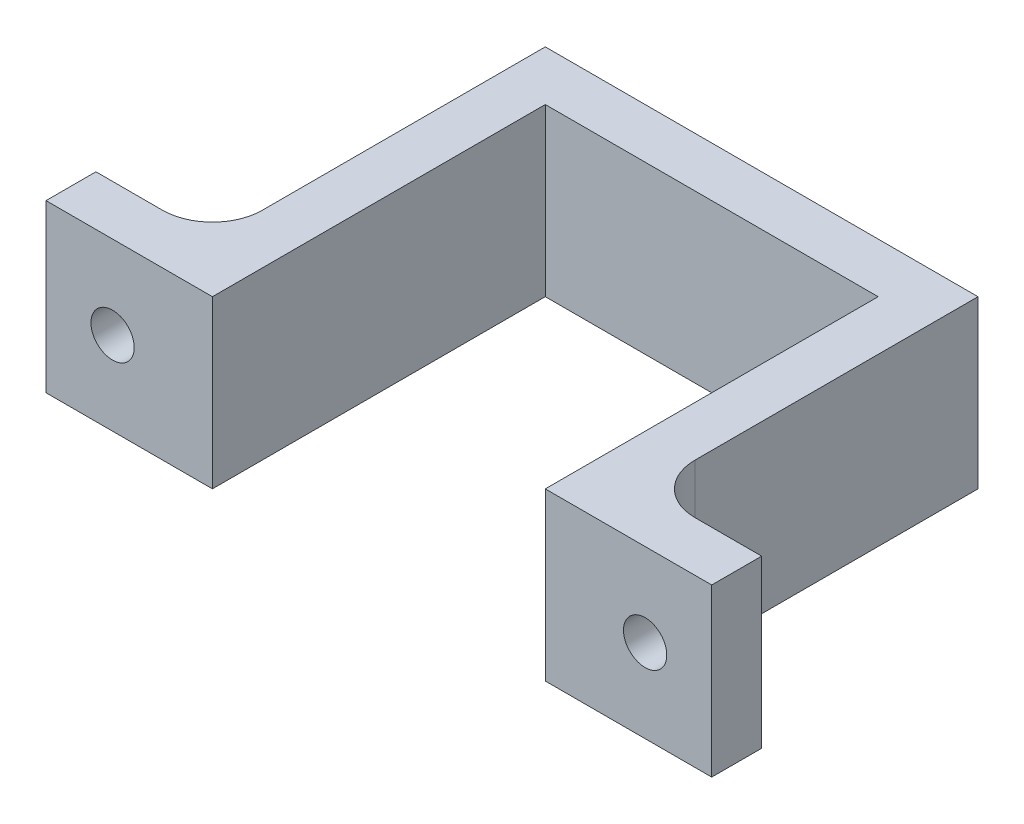
ISO-10303-21;
HEADER;
FILE_DESCRIPTION(('STEP AP214'),'2;1');
FILE_NAME('part.step','',(''),(''),'','','');
FILE_SCHEMA(('AUTOMOTIVE_DESIGN { 1 0 10303 214 1 1 1 1 }'));
ENDSEC;
DATA;
#1=APPLICATION_CONTEXT('core data for automotive mechanical design processes');
#2=APPLICATION_PROTOCOL_DEFINITION('international standard','automotive_design',2000,#1);
#3=PRODUCT_CONTEXT('',#1,'mechanical');
#4=PRODUCT('Part','Part','',(#3));
#5=PRODUCT_RELATED_PRODUCT_CATEGORY('part','',(#4));
#6=PRODUCT_DEFINITION_FORMATION('','',#4);
#7=PRODUCT_DEFINITION_CONTEXT('part definition',#1,'design');
#8=PRODUCT_DEFINITION('design','',#6,#7);
#9=PRODUCT_DEFINITION_SHAPE('','',#8);
#10=(LENGTH_UNIT() NAMED_UNIT(*) SI_UNIT(.MILLI.,.METRE.));
#11=(NAMED_UNIT(*) PLANE_ANGLE_UNIT() SI_UNIT($,.RADIAN.));
#12=(NAMED_UNIT(*) SI_UNIT($,.STERADIAN.) SOLID_ANGLE_UNIT());
#13=UNCERTAINTY_MEASURE_WITH_UNIT(LENGTH_MEASURE(1.E-05),#10,'distance_accuracy_value','');
#14=(GEOMETRIC_REPRESENTATION_CONTEXT(3) GLOBAL_UNCERTAINTY_ASSIGNED_CONTEXT((#13)) GLOBAL_UNIT_ASSIGNED_CONTEXT((#10,
#11,#12)) REPRESENTATION_CONTEXT('',''));
#15=CARTESIAN_POINT('',(0.,0.,0.));
#16=DIRECTION('',(0.,0.,1.));
#17=DIRECTION('',(1.,0.,0.));
#18=AXIS2_PLACEMENT_3D('',#15,#16,#17);
#19=CARTESIAN_POINT('',(-20.,10.,11.5));
#20=DIRECTION('',(0.,0.,-1.));
#21=DIRECTION('',(-1.,0.,0.));
#22=AXIS2_PLACEMENT_3D('',#19,#20,#21);
#23=PLANE('',#22);
#24=CARTESIAN_POINT('',(-16.,5.,11.5));
#25=DIRECTION('',(0.,0.,-1.));
#26=DIRECTION('',(-1.,0.,0.));
#27=AXIS2_PLACEMENT_3D('',#24,#25,#26);
#28=CIRCLE('',#27,1.3);
#29=CARTESIAN_POINT('',(-17.3,5.,11.5));
#30=VERTEX_POINT('',#29);
#31=EDGE_CURVE('E307',#30,#30,#28,.T.);
#32=ORIENTED_EDGE('',*,*,#31,.T.);
#33=EDGE_LOOP('',(#32));
#34=FACE_BOUND('',#33,.T.);
#35=DIRECTION('',(1.,0.,0.));
#36=VECTOR('',#35,1.);
#37=CARTESIAN_POINT('',(-20.,0.,11.5));
#38=LINE('',#37,#36);
#39=CARTESIAN_POINT('',(-20.,0.,11.5));
#40=VERTEX_POINT('',#39);
#41=CARTESIAN_POINT('',(-10.,0.,11.5));
#42=VERTEX_POINT('',#41);
#43=EDGE_CURVE('E168',#40,#42,#38,.T.);
#44=ORIENTED_EDGE('',*,*,#43,.T.);
#45=DIRECTION('',(0.,1.,0.));
#46=VECTOR('',#45,1.);
#47=CARTESIAN_POINT('',(-10.,0.,11.5));
#48=LINE('',#47,#46);
#49=CARTESIAN_POINT('',(-10.,10.,11.5));
#50=VERTEX_POINT('',#49);
#51=EDGE_CURVE('E150',#42,#50,#48,.T.);
#52=ORIENTED_EDGE('',*,*,#51,.T.);
#53=DIRECTION('',(1.,0.,0.));
#54=VECTOR('',#53,1.);
#55=CARTESIAN_POINT('',(-20.,10.,11.5));
#56=LINE('',#55,#54);
#57=CARTESIAN_POINT('',(-20.,10.,11.5));
#58=VERTEX_POINT('',#57);
#59=EDGE_CURVE('E189',#58,#50,#56,.T.);
#60=ORIENTED_EDGE('',*,*,#59,.F.);
#61=DIRECTION('',(0.,-1.,0.));
#62=VECTOR('',#61,1.);
#63=CARTESIAN_POINT('',(-20.,10.,11.5));
#64=LINE('',#63,#62);
#65=EDGE_CURVE('E175',#58,#40,#64,.T.);
#66=ORIENTED_EDGE('',*,*,#65,.T.);
#67=EDGE_LOOP('',(#44,#52,#60,#66));
#68=FACE_BOUND('',#67,.T.);
#69=ADVANCED_FACE('F35',(#34,#68),#23,.F.);
#70=CARTESIAN_POINT('',(20.,10.,-11.5));
#71=DIRECTION('',(-1.,0.,0.));
#72=DIRECTION('',(0.,0.,1.));
#73=AXIS2_PLACEMENT_3D('',#70,#71,#72);
#74=PLANE('',#73);
#75=DIRECTION('',(0.,0.,-1.));
#76=VECTOR('',#75,1.);
#77=CARTESIAN_POINT('',(20.,0.,-11.5));
#78=LINE('',#77,#76);
#79=CARTESIAN_POINT('',(20.,0.,11.5));
#80=VERTEX_POINT('',#79);
#81=CARTESIAN_POINT('',(20.,0.,8.5));
#82=VERTEX_POINT('',#81);
#83=EDGE_CURVE('E342',#80,#82,#78,.T.);
#84=ORIENTED_EDGE('',*,*,#83,.T.);
#85=DIRECTION('',(0.,1.,0.));
#86=VECTOR('',#85,1.);
#87=CARTESIAN_POINT('',(20.,0.,8.5));
#88=LINE('',#87,#86);
#89=CARTESIAN_POINT('',(20.,10.,8.5));
#90=VERTEX_POINT('',#89);
#91=EDGE_CURVE('E326',#82,#90,#88,.T.);
#92=ORIENTED_EDGE('',*,*,#91,.T.);
#93=DIRECTION('',(0.,0.,-1.));
#94=VECTOR('',#93,1.);
#95=CARTESIAN_POINT('',(20.,10.,-11.5));
#96=LINE('',#95,#94);
#97=CARTESIAN_POINT('',(20.,10.,11.5));
#98=VERTEX_POINT('',#97);
#99=EDGE_CURVE('E176',#98,#90,#96,.T.);
#100=ORIENTED_EDGE('',*,*,#99,.F.);
#101=DIRECTION('',(0.,-1.,0.));
#102=VECTOR('',#101,1.);
#103=CARTESIAN_POINT('',(20.,10.,11.5));
#104=LINE('',#103,#102);
#105=EDGE_CURVE('E186',#98,#80,#104,.T.);
#106=ORIENTED_EDGE('',*,*,#105,.T.);
#107=EDGE_LOOP('',(#84,#92,#100,#106));
#108=FACE_BOUND('',#107,.T.);
#109=ADVANCED_FACE('F214',(#108),#74,.F.);
#110=CARTESIAN_POINT('',(-20.,10.,-11.5));
#111=DIRECTION('',(0.,0.,1.));
#112=DIRECTION('',(1.,0.,0.));
#113=AXIS2_PLACEMENT_3D('',#110,#111,#112);
#114=PLANE('',#113);
#115=DIRECTION('',(-1.,0.,0.));
#116=VECTOR('',#115,1.);
#117=CARTESIAN_POINT('',(-20.,10.,-11.5));
#118=LINE('',#117,#116);
#119=CARTESIAN_POINT('',(13.,10.,-11.5));
#120=VERTEX_POINT('',#119);
#121=CARTESIAN_POINT('',(-13.,10.,-11.5));
#122=VERTEX_POINT('',#121);
#123=EDGE_CURVE('E180',#120,#122,#118,.T.);
#124=ORIENTED_EDGE('',*,*,#123,.F.);
#125=DIRECTION('',(0.,1.,0.));
#126=VECTOR('',#125,1.);
#127=CARTESIAN_POINT('',(13.,0.,-11.5));
#128=LINE('',#127,#126);
#129=CARTESIAN_POINT('',(13.,0.,-11.5));
#130=VERTEX_POINT('',#129);
#131=EDGE_CURVE('E288',#130,#120,#128,.T.);
#132=ORIENTED_EDGE('',*,*,#131,.F.);
#133=DIRECTION('',(-1.,0.,0.));
#134=VECTOR('',#133,1.);
#135=CARTESIAN_POINT('',(-20.,0.,-11.5));
#136=LINE('',#135,#134);
#137=CARTESIAN_POINT('',(-13.,0.,-11.5));
#138=VERTEX_POINT('',#137);
#139=EDGE_CURVE('E350',#130,#138,#136,.T.);
#140=ORIENTED_EDGE('',*,*,#139,.T.);
#141=DIRECTION('',(0.,1.,0.));
#142=VECTOR('',#141,1.);
#143=CARTESIAN_POINT('',(-13.,0.,-11.5));
#144=LINE('',#143,#142);
#145=EDGE_CURVE('E339',#138,#122,#144,.T.);
#146=ORIENTED_EDGE('',*,*,#145,.T.);
#147=EDGE_LOOP('',(#124,#132,#140,#146));
#148=FACE_BOUND('',#147,.T.);
#149=ADVANCED_FACE('F217',(#148),#114,.F.);
#150=CARTESIAN_POINT('',(-20.,10.,-11.5));
#151=DIRECTION('',(1.,0.,0.));
#152=DIRECTION('',(0.,0.,-1.));
#153=AXIS2_PLACEMENT_3D('',#150,#151,#152);
#154=PLANE('',#153);
#155=DIRECTION('',(0.,0.,1.));
#156=VECTOR('',#155,1.);
#157=CARTESIAN_POINT('',(-20.,10.,-11.5));
#158=LINE('',#157,#156);
#159=CARTESIAN_POINT('',(-20.,10.,8.5));
#160=VERTEX_POINT('',#159);
#161=EDGE_CURVE('E345',#160,#58,#158,.T.);
#162=ORIENTED_EDGE('',*,*,#161,.F.);
#163=DIRECTION('',(0.,1.,0.));
#164=VECTOR('',#163,1.);
#165=CARTESIAN_POINT('',(-20.,0.,8.5));
#166=LINE('',#165,#164);
#167=CARTESIAN_POINT('',(-20.,0.,8.5));
#168=VERTEX_POINT('',#167);
#169=EDGE_CURVE('E336',#168,#160,#166,.T.);
#170=ORIENTED_EDGE('',*,*,#169,.F.);
#171=DIRECTION('',(0.,0.,1.));
#172=VECTOR('',#171,1.);
#173=CARTESIAN_POINT('',(-20.,0.,-11.5));
#174=LINE('',#173,#172);
#175=EDGE_CURVE('E182',#168,#40,#174,.T.);
#176=ORIENTED_EDGE('',*,*,#175,.T.);
#177=ORIENTED_EDGE('',*,*,#65,.F.);
#178=EDGE_LOOP('',(#162,#170,#176,#177));
#179=FACE_BOUND('',#178,.T.);
#180=ADVANCED_FACE('F221',(#179),#154,.F.);
#181=CARTESIAN_POINT('',(16.,5.,11.5));
#182=DIRECTION('',(0.,0.,-1.));
#183=DIRECTION('',(-1.,0.,0.));
#184=AXIS2_PLACEMENT_3D('',#181,#182,#183);
#185=CIRCLE('',#184,1.3);
#186=CARTESIAN_POINT('',(14.7,5.,11.5));
#187=VERTEX_POINT('',#186);
#188=EDGE_CURVE('E299',#187,#187,#185,.T.);
#189=ORIENTED_EDGE('',*,*,#188,.T.);
#190=EDGE_LOOP('',(#189));
#191=FACE_BOUND('',#190,.T.);
#192=CARTESIAN_POINT('',(10.,10.,11.5));
#193=VERTEX_POINT('',#192);
#194=EDGE_CURVE('E347',#193,#98,#56,.T.);
#195=ORIENTED_EDGE('',*,*,#194,.F.);
#196=DIRECTION('',(0.,1.,0.));
#197=VECTOR('',#196,1.);
#198=CARTESIAN_POINT('',(10.,0.,11.5));
#199=LINE('',#198,#197);
#200=CARTESIAN_POINT('',(10.,0.,11.5));
#201=VERTEX_POINT('',#200);
#202=EDGE_CURVE('E161',#201,#193,#199,.T.);
#203=ORIENTED_EDGE('',*,*,#202,.F.);
#204=EDGE_CURVE('E177',#201,#80,#38,.T.);
#205=ORIENTED_EDGE('',*,*,#204,.T.);
#206=ORIENTED_EDGE('',*,*,#105,.F.);
#207=EDGE_LOOP('',(#195,#203,#205,#206));
#208=FACE_BOUND('',#207,.T.);
#209=ADVANCED_FACE('F225',(#191,#208),#23,.F.);
#210=CARTESIAN_POINT('',(0.,10.,0.));
#211=DIRECTION('',(0.,1.,0.));
#212=DIRECTION('',(0.,0.,1.));
#213=AXIS2_PLACEMENT_3D('',#210,#211,#212);
#214=PLANE('',#213);
#215=DIRECTION('',(0.,0.,1.));
#216=VECTOR('',#215,1.);
#217=CARTESIAN_POINT('',(-10.,10.,11.5));
#218=LINE('',#217,#216);
#219=CARTESIAN_POINT('',(-10.,10.,-8.5));
#220=VERTEX_POINT('',#219);
#221=EDGE_CURVE('E156',#220,#50,#218,.T.);
#222=ORIENTED_EDGE('',*,*,#221,.F.);
#223=DIRECTION('',(-1.,0.,0.));
#224=VECTOR('',#223,1.);
#225=CARTESIAN_POINT('',(-10.,10.,-8.5));
#226=LINE('',#225,#224);
#227=CARTESIAN_POINT('',(10.,10.,-8.5));
#228=VERTEX_POINT('',#227);
#229=EDGE_CURVE('E171',#228,#220,#226,.T.);
#230=ORIENTED_EDGE('',*,*,#229,.F.);
#231=DIRECTION('',(0.,0.,-1.));
#232=VECTOR('',#231,1.);
#233=CARTESIAN_POINT('',(10.,10.,11.5));
#234=LINE('',#233,#232);
#235=EDGE_CURVE('E313',#193,#228,#234,.T.);
#236=ORIENTED_EDGE('',*,*,#235,.F.);
#237=ORIENTED_EDGE('',*,*,#194,.T.);
#238=ORIENTED_EDGE('',*,*,#99,.T.);
#239=DIRECTION('',(1.,0.,0.));
#240=VECTOR('',#239,1.);
#241=CARTESIAN_POINT('',(20.,10.,8.5));
#242=LINE('',#241,#240);
#243=CARTESIAN_POINT('',(16.,10.,8.5));
#244=VERTEX_POINT('',#243);
#245=EDGE_CURVE('E284',#244,#90,#242,.T.);
#246=ORIENTED_EDGE('',*,*,#245,.F.);
#247=CARTESIAN_POINT('',(16.,10.,5.5));
#248=DIRECTION('',(0.,1.,0.));
#249=DIRECTION('',(0.,0.,1.));
#250=AXIS2_PLACEMENT_3D('',#247,#248,#249);
#251=CIRCLE('',#250,3.);
#252=CARTESIAN_POINT('',(13.,10.,5.50000000000001));
#253=VERTEX_POINT('',#252);
#254=EDGE_CURVE('E204',#244,#253,#251,.F.);
#255=ORIENTED_EDGE('',*,*,#254,.T.);
#256=DIRECTION('',(0.,0.,1.));
#257=VECTOR('',#256,1.);
#258=CARTESIAN_POINT('',(13.,10.,-11.5));
#259=LINE('',#258,#257);
#260=EDGE_CURVE('E282',#120,#253,#259,.T.);
#261=ORIENTED_EDGE('',*,*,#260,.F.);
#262=ORIENTED_EDGE('',*,*,#123,.T.);
#263=DIRECTION('',(0.,0.,-1.));
#264=VECTOR('',#263,1.);
#265=CARTESIAN_POINT('',(-13.,10.,-11.5));
#266=LINE('',#265,#264);
#267=CARTESIAN_POINT('',(-13.,10.,5.50000000000001));
#268=VERTEX_POINT('',#267);
#269=EDGE_CURVE('E334',#268,#122,#266,.T.);
#270=ORIENTED_EDGE('',*,*,#269,.F.);
#271=CARTESIAN_POINT('',(-16.,10.,5.50000000000001));
#272=DIRECTION('',(0.,1.,0.));
#273=DIRECTION('',(0.,0.,1.));
#274=AXIS2_PLACEMENT_3D('',#271,#272,#273);
#275=CIRCLE('',#274,3.);
#276=CARTESIAN_POINT('',(-16.,10.,8.5));
#277=VERTEX_POINT('',#276);
#278=EDGE_CURVE('E59',#268,#277,#275,.F.);
#279=ORIENTED_EDGE('',*,*,#278,.T.);
#280=DIRECTION('',(1.,0.,0.));
#281=VECTOR('',#280,1.);
#282=CARTESIAN_POINT('',(-20.,10.,8.5));
#283=LINE('',#282,#281);
#284=EDGE_CURVE('E329',#160,#277,#283,.T.);
#285=ORIENTED_EDGE('',*,*,#284,.F.);
#286=ORIENTED_EDGE('',*,*,#161,.T.);
#287=ORIENTED_EDGE('',*,*,#59,.T.);
#288=EDGE_LOOP('',(#222,#230,#236,#237,#238,#246,#255,#261,#262,#270,#279,#285,#286,#287));
#289=FACE_BOUND('',#288,.T.);
#290=ADVANCED_FACE('F229',(#289),#214,.T.);
#291=CARTESIAN_POINT('',(0.,0.,0.));
#292=DIRECTION('',(0.,1.,0.));
#293=DIRECTION('',(0.,0.,1.));
#294=AXIS2_PLACEMENT_3D('',#291,#292,#293);
#295=PLANE('',#294);
#296=DIRECTION('',(-1.,0.,0.));
#297=VECTOR('',#296,1.);
#298=CARTESIAN_POINT('',(-10.,0.,-8.5));
#299=LINE('',#298,#297);
#300=CARTESIAN_POINT('',(10.,0.,-8.5));
#301=VERTEX_POINT('',#300);
#302=CARTESIAN_POINT('',(-10.,0.,-8.5));
#303=VERTEX_POINT('',#302);
#304=EDGE_CURVE('E162',#301,#303,#299,.T.);
#305=ORIENTED_EDGE('',*,*,#304,.T.);
#306=DIRECTION('',(0.,0.,1.));
#307=VECTOR('',#306,1.);
#308=CARTESIAN_POINT('',(-10.,0.,11.5));
#309=LINE('',#308,#307);
#310=EDGE_CURVE('E153',#303,#42,#309,.T.);
#311=ORIENTED_EDGE('',*,*,#310,.T.);
#312=ORIENTED_EDGE('',*,*,#43,.F.);
#313=ORIENTED_EDGE('',*,*,#175,.F.);
#314=DIRECTION('',(1.,0.,0.));
#315=VECTOR('',#314,1.);
#316=CARTESIAN_POINT('',(-20.,0.,8.5));
#317=LINE('',#316,#315);
#318=CARTESIAN_POINT('',(-16.,0.,8.5));
#319=VERTEX_POINT('',#318);
#320=EDGE_CURVE('E331',#168,#319,#317,.T.);
#321=ORIENTED_EDGE('',*,*,#320,.T.);
#322=CARTESIAN_POINT('',(-16.,0.,5.50000000000001));
#323=DIRECTION('',(0.,1.,0.));
#324=DIRECTION('',(0.,0.,1.));
#325=AXIS2_PLACEMENT_3D('',#322,#323,#324);
#326=CIRCLE('',#325,3.);
#327=CARTESIAN_POINT('',(-13.,0.,5.50000000000001));
#328=VERTEX_POINT('',#327);
#329=EDGE_CURVE('E11',#319,#328,#326,.T.);
#330=ORIENTED_EDGE('',*,*,#329,.T.);
#331=DIRECTION('',(0.,0.,-1.));
#332=VECTOR('',#331,1.);
#333=CARTESIAN_POINT('',(-13.,0.,-11.5));
#334=LINE('',#333,#332);
#335=EDGE_CURVE('E333',#328,#138,#334,.T.);
#336=ORIENTED_EDGE('',*,*,#335,.T.);
#337=ORIENTED_EDGE('',*,*,#139,.F.);
#338=DIRECTION('',(0.,0.,1.));
#339=VECTOR('',#338,1.);
#340=CARTESIAN_POINT('',(13.,0.,-11.5));
#341=LINE('',#340,#339);
#342=CARTESIAN_POINT('',(13.,0.,5.50000000000001));
#343=VERTEX_POINT('',#342);
#344=EDGE_CURVE('E322',#130,#343,#341,.T.);
#345=ORIENTED_EDGE('',*,*,#344,.T.);
#346=CARTESIAN_POINT('',(16.,0.,5.5));
#347=DIRECTION('',(0.,1.,0.));
#348=DIRECTION('',(0.,0.,1.));
#349=AXIS2_PLACEMENT_3D('',#346,#347,#348);
#350=CIRCLE('',#349,3.);
#351=CARTESIAN_POINT('',(16.,0.,8.5));
#352=VERTEX_POINT('',#351);
#353=EDGE_CURVE('E273',#343,#352,#350,.T.);
#354=ORIENTED_EDGE('',*,*,#353,.T.);
#355=DIRECTION('',(1.,0.,0.));
#356=VECTOR('',#355,1.);
#357=CARTESIAN_POINT('',(20.,0.,8.5));
#358=LINE('',#357,#356);
#359=EDGE_CURVE('E296',#352,#82,#358,.T.);
#360=ORIENTED_EDGE('',*,*,#359,.T.);
#361=ORIENTED_EDGE('',*,*,#83,.F.);
#362=ORIENTED_EDGE('',*,*,#204,.F.);
#363=DIRECTION('',(0.,0.,-1.));
#364=VECTOR('',#363,1.);
#365=CARTESIAN_POINT('',(10.,0.,11.5));
#366=LINE('',#365,#364);
#367=EDGE_CURVE('E170',#201,#301,#366,.T.);
#368=ORIENTED_EDGE('',*,*,#367,.T.);
#369=EDGE_LOOP('',(#305,#311,#312,#313,#321,#330,#336,#337,#345,#354,#360,#361,#362,#368));
#370=FACE_BOUND('',#369,.T.);
#371=ADVANCED_FACE('F166',(#370),#295,.F.);
#372=CARTESIAN_POINT('',(-13.,0.,-11.5));
#373=DIRECTION('',(1.,0.,0.));
#374=DIRECTION('',(0.,0.,-1.));
#375=AXIS2_PLACEMENT_3D('',#372,#373,#374);
#376=PLANE('',#375);
#377=ORIENTED_EDGE('',*,*,#335,.F.);
#378=DIRECTION('',(0.,1.,0.));
#379=VECTOR('',#378,1.);
#380=CARTESIAN_POINT('',(-13.,10.,5.50000000000001));
#381=LINE('',#380,#379);
#382=EDGE_CURVE('E271',#328,#268,#381,.T.);
#383=ORIENTED_EDGE('',*,*,#382,.T.);
#384=ORIENTED_EDGE('',*,*,#269,.T.);
#385=ORIENTED_EDGE('',*,*,#145,.F.);
#386=EDGE_LOOP('',(#377,#383,#384,#385));
#387=FACE_BOUND('',#386,.T.);
#388=ADVANCED_FACE('F233',(#387),#376,.F.);
#389=CARTESIAN_POINT('',(-20.,0.,8.5));
#390=DIRECTION('',(0.,0.,1.));
#391=DIRECTION('',(1.,0.,0.));
#392=AXIS2_PLACEMENT_3D('',#389,#390,#391);
#393=PLANE('',#392);
#394=ORIENTED_EDGE('',*,*,#284,.T.);
#395=DIRECTION('',(0.,1.,0.));
#396=VECTOR('',#395,1.);
#397=CARTESIAN_POINT('',(-16.,0.,8.5));
#398=LINE('',#397,#396);
#399=CARTESIAN_POINT('',(-16.,6.3,8.5));
#400=VERTEX_POINT('',#399);
#401=EDGE_CURVE('E268',#277,#400,#398,.F.);
#402=ORIENTED_EDGE('',*,*,#401,.T.);
#403=CARTESIAN_POINT('',(-16.,5.,8.5));
#404=DIRECTION('',(0.,0.,-1.));
#405=DIRECTION('',(-1.,0.,0.));
#406=AXIS2_PLACEMENT_3D('',#403,#404,#405);
#407=CIRCLE('',#406,1.3);
#408=CARTESIAN_POINT('',(-16.,3.70000000000001,8.5));
#409=VERTEX_POINT('',#408);
#410=EDGE_CURVE('E302',#409,#400,#407,.T.);
#411=ORIENTED_EDGE('',*,*,#410,.F.);
#412=DIRECTION('',(0.,1.,0.));
#413=VECTOR('',#412,1.);
#414=CARTESIAN_POINT('',(-16.,0.,8.5));
#415=LINE('',#414,#413);
#416=EDGE_CURVE('E51',#409,#319,#415,.F.);
#417=ORIENTED_EDGE('',*,*,#416,.T.);
#418=ORIENTED_EDGE('',*,*,#320,.F.);
#419=ORIENTED_EDGE('',*,*,#169,.T.);
#420=EDGE_LOOP('',(#394,#402,#411,#417,#418,#419));
#421=FACE_BOUND('',#420,.T.);
#422=ADVANCED_FACE('F236',(#421),#393,.F.);
#423=CARTESIAN_POINT('',(20.,0.,8.5));
#424=DIRECTION('',(0.,0.,1.));
#425=DIRECTION('',(1.,0.,0.));
#426=AXIS2_PLACEMENT_3D('',#423,#424,#425);
#427=PLANE('',#426);
#428=ORIENTED_EDGE('',*,*,#359,.F.);
#429=DIRECTION('',(0.,1.,0.));
#430=VECTOR('',#429,1.);
#431=CARTESIAN_POINT('',(16.,10.,8.5));
#432=LINE('',#431,#430);
#433=CARTESIAN_POINT('',(16.,3.7,8.5));
#434=VERTEX_POINT('',#433);
#435=EDGE_CURVE('E193',#352,#434,#432,.T.);
#436=ORIENTED_EDGE('',*,*,#435,.T.);
#437=CARTESIAN_POINT('',(16.,5.,8.5));
#438=DIRECTION('',(0.,0.,-1.));
#439=DIRECTION('',(-1.,0.,0.));
#440=AXIS2_PLACEMENT_3D('',#437,#438,#439);
#441=CIRCLE('',#440,1.3);
#442=CARTESIAN_POINT('',(16.,6.3,8.5));
#443=VERTEX_POINT('',#442);
#444=EDGE_CURVE('E294',#443,#434,#441,.T.);
#445=ORIENTED_EDGE('',*,*,#444,.F.);
#446=DIRECTION('',(0.,1.,0.));
#447=VECTOR('',#446,1.);
#448=CARTESIAN_POINT('',(16.,10.,8.5));
#449=LINE('',#448,#447);
#450=EDGE_CURVE('E191',#443,#244,#449,.T.);
#451=ORIENTED_EDGE('',*,*,#450,.T.);
#452=ORIENTED_EDGE('',*,*,#245,.T.);
#453=ORIENTED_EDGE('',*,*,#91,.F.);
#454=EDGE_LOOP('',(#428,#436,#445,#451,#452,#453));
#455=FACE_BOUND('',#454,.T.);
#456=ADVANCED_FACE('F239',(#455),#427,.F.);
#457=CARTESIAN_POINT('',(13.,0.,-11.5));
#458=DIRECTION('',(-1.,0.,0.));
#459=DIRECTION('',(0.,0.,1.));
#460=AXIS2_PLACEMENT_3D('',#457,#458,#459);
#461=PLANE('',#460);
#462=ORIENTED_EDGE('',*,*,#260,.T.);
#463=DIRECTION('',(0.,1.,0.));
#464=VECTOR('',#463,1.);
#465=CARTESIAN_POINT('',(13.,0.,5.5));
#466=LINE('',#465,#464);
#467=EDGE_CURVE('E196',#253,#343,#466,.F.);
#468=ORIENTED_EDGE('',*,*,#467,.T.);
#469=ORIENTED_EDGE('',*,*,#344,.F.);
#470=ORIENTED_EDGE('',*,*,#131,.T.);
#471=EDGE_LOOP('',(#462,#468,#469,#470));
#472=FACE_BOUND('',#471,.T.);
#473=ADVANCED_FACE('F243',(#472),#461,.F.);
#474=CARTESIAN_POINT('',(-10.,0.,11.5));
#475=DIRECTION('',(-1.,0.,0.));
#476=DIRECTION('',(0.,0.,1.));
#477=AXIS2_PLACEMENT_3D('',#474,#475,#476);
#478=PLANE('',#477);
#479=ORIENTED_EDGE('',*,*,#221,.T.);
#480=ORIENTED_EDGE('',*,*,#51,.F.);
#481=ORIENTED_EDGE('',*,*,#310,.F.);
#482=DIRECTION('',(0.,1.,0.));
#483=VECTOR('',#482,1.);
#484=CARTESIAN_POINT('',(-10.,0.,-8.5));
#485=LINE('',#484,#483);
#486=EDGE_CURVE('E289',#303,#220,#485,.T.);
#487=ORIENTED_EDGE('',*,*,#486,.T.);
#488=EDGE_LOOP('',(#479,#480,#481,#487));
#489=FACE_BOUND('',#488,.T.);
#490=ADVANCED_FACE('F152',(#489),#478,.F.);
#491=CARTESIAN_POINT('',(-10.,0.,-8.5));
#492=DIRECTION('',(0.,0.,-1.));
#493=DIRECTION('',(-1.,0.,0.));
#494=AXIS2_PLACEMENT_3D('',#491,#492,#493);
#495=PLANE('',#494);
#496=ORIENTED_EDGE('',*,*,#229,.T.);
#497=ORIENTED_EDGE('',*,*,#486,.F.);
#498=ORIENTED_EDGE('',*,*,#304,.F.);
#499=DIRECTION('',(0.,1.,0.));
#500=VECTOR('',#499,1.);
#501=CARTESIAN_POINT('',(10.,0.,-8.5));
#502=LINE('',#501,#500);
#503=EDGE_CURVE('E319',#301,#228,#502,.T.);
#504=ORIENTED_EDGE('',*,*,#503,.T.);
#505=EDGE_LOOP('',(#496,#497,#498,#504));
#506=FACE_BOUND('',#505,.T.);
#507=ADVANCED_FACE('F252',(#506),#495,.F.);
#508=CARTESIAN_POINT('',(10.,0.,11.5));
#509=DIRECTION('',(1.,0.,0.));
#510=DIRECTION('',(0.,0.,-1.));
#511=AXIS2_PLACEMENT_3D('',#508,#509,#510);
#512=PLANE('',#511);
#513=ORIENTED_EDGE('',*,*,#235,.T.);
#514=ORIENTED_EDGE('',*,*,#503,.F.);
#515=ORIENTED_EDGE('',*,*,#367,.F.);
#516=ORIENTED_EDGE('',*,*,#202,.T.);
#517=EDGE_LOOP('',(#513,#514,#515,#516));
#518=FACE_BOUND('',#517,.T.);
#519=ADVANCED_FACE('F253',(#518),#512,.F.);
#520=CARTESIAN_POINT('',(-16.,5.,18.5));
#521=DIRECTION('',(0.,0.,-1.));
#522=DIRECTION('',(-1.,0.,0.));
#523=AXIS2_PLACEMENT_3D('',#520,#521,#522);
#524=CYLINDRICAL_SURFACE('',#523,1.3);
#525=ORIENTED_EDGE('',*,*,#410,.T.);
#526=CARTESIAN_POINT('',(-16.,6.3,8.5));
#527=CARTESIAN_POINT('',(-15.9651448508818,6.30000141557976,8.50000320237138));
#528=CARTESIAN_POINT('',(-15.9303078215828,6.29859727581413,8.49939186757511));
#529=CARTESIAN_POINT('',(-15.8609108394291,6.29300654275464,8.49697456172675));
#530=CARTESIAN_POINT('',(-15.8263507986866,6.28882087052166,8.49516898612971));
#531=CARTESIAN_POINT('',(-15.7237329956097,6.27218506480715,8.488034182056));
#532=CARTESIAN_POINT('',(-15.6564078226007,6.25565550913431,8.480986216524));
#533=CARTESIAN_POINT('',(-15.5258011182117,6.2123837469942,8.46302066121122));
#534=CARTESIAN_POINT('',(-15.4625162757428,6.18565003166062,8.45210628930437));
#535=CARTESIAN_POINT('',(-15.3413128877282,6.12285063673429,8.4274494211176));
#536=CARTESIAN_POINT('',(-15.2833987969312,6.08677730281567,8.41370460703579));
#537=CARTESIAN_POINT('',(-15.1715160620953,6.00432833947009,8.38394316069797));
#538=CARTESIAN_POINT('',(-15.117873259235,5.95753914361419,8.3678488480556));
#539=CARTESIAN_POINT('',(-15.0189137415758,5.85586575384752,8.33552185104746));
#540=CARTESIAN_POINT('',(-14.9736008319963,5.80097788087649,8.31928910696963));
#541=CARTESIAN_POINT('',(-14.8901435363494,5.68105670111653,8.28752975825481));
#542=CARTESIAN_POINT('',(-14.8525218239738,5.61563439655784,8.27208932194686));
#543=CARTESIAN_POINT('',(-14.7889642749919,5.47862891158654,8.24492184090836));
#544=CARTESIAN_POINT('',(-14.763021693129,5.40704931583223,8.23319265392007));
#545=CARTESIAN_POINT('',(-14.7249432840047,5.26354391040319,8.21563113564593));
#546=CARTESIAN_POINT('',(-14.7121721153078,5.19182102857364,8.2095291309789));
#547=CARTESIAN_POINT('',(-14.6988203420072,5.04700935588749,8.20314487885665));
#548=CARTESIAN_POINT('',(-14.6982324584499,4.97392140672542,8.20285915644158));
#549=CARTESIAN_POINT('',(-14.7087889038924,4.83503396033955,8.20791376151514));
#550=CARTESIAN_POINT('',(-14.7189495183059,4.76913895572964,8.21278238680405));
#551=CARTESIAN_POINT('',(-14.7490540293332,4.64010393180524,8.22679424888105));
#552=CARTESIAN_POINT('',(-14.7689998026631,4.57696444350762,8.23593830564728));
#553=CARTESIAN_POINT('',(-14.8185024432864,4.45357343720616,8.25768114940469));
#554=CARTESIAN_POINT('',(-14.8482613505379,4.39341617608801,8.27035160198767));
#555=CARTESIAN_POINT('',(-14.9164020950347,4.27870186691168,8.29770645147222));
#556=CARTESIAN_POINT('',(-14.9547876207339,4.2241472289281,8.31239170878775));
#557=CARTESIAN_POINT('',(-15.0432341651786,4.11690116229475,8.3437641929929));
#558=CARTESIAN_POINT('',(-15.0940446998896,4.06484358541242,8.36051126466874));
#559=CARTESIAN_POINT('',(-15.2038334403745,3.96976048124679,8.39299038037487));
#560=CARTESIAN_POINT('',(-15.2628146298699,3.9267382679615,8.40872205051505));
#561=CARTESIAN_POINT('',(-15.3893460735443,3.84990095420708,8.43792930851925));
#562=CARTESIAN_POINT('',(-15.4570862023689,3.81636905005371,8.45133164049095));
#563=CARTESIAN_POINT('',(-15.5979440744469,3.7614351937765,8.47378711760866));
#564=CARTESIAN_POINT('',(-15.6710530111745,3.74001385740773,8.48284720940939));
#565=CARTESIAN_POINT('',(-15.7874007353428,3.71679205836481,8.49275280077214));
#566=CARTESIAN_POINT('',(-15.8296346487417,3.71050572014504,8.49545864370798));
#567=CARTESIAN_POINT('',(-15.9145697380395,3.70210783735578,8.49908625940342));
#568=CARTESIAN_POINT('',(-15.9572706777244,3.69999427230151,8.50000889559914));
#569=CARTESIAN_POINT('',(-16.,3.70000000000001,8.50000000000001));
#570=B_SPLINE_CURVE_WITH_KNOTS('',3,(#526,#527,#528,#529,#530,#531,#532,#533,#534,#535,#536,
#537,#538,#539,#540,#541,#542,#543,#544,#545,#546,#547,#548,#549,#550,#551,#552,#553,#554,#555,
#556,#557,#558,#559,#560,#561,#562,#563,#564,#565,#566,#567,#568,#569),.UNSPECIFIED.,.F.,.F.,(4,
2,2,2,2,2,2,2,2,2,2,2,2,2,2,2,2,2,2,2,2,4),(0.,0.104496603927171,0.208958622672603,
0.416906889786127,0.624682493913941,0.832628923474524,1.05062284670503,1.26871610667998,
1.49864855091273,1.72844802725698,1.94655503350991,2.16453172707905,2.36415421770615,
2.56381500932322,2.76787404599783,2.97202049805733,3.19496018869867,3.41798150708319,
3.64708702491559,3.87582478930764,4.00395877118705,4.13203069450072),.UNSPECIFIED.);
#571=EDGE_CURVE('E44',#400,#409,#570,.T.);
#572=ORIENTED_EDGE('',*,*,#571,.T.);
#573=EDGE_LOOP('',(#525,#572));
#574=FACE_BOUND('',#573,.T.);
#575=ORIENTED_EDGE('',*,*,#31,.F.);
#576=EDGE_LOOP('',(#575));
#577=FACE_BOUND('',#576,.T.);
#578=ADVANCED_FACE('F256',(#574,#577),#524,.F.);
#579=CARTESIAN_POINT('',(16.,5.,18.5));
#580=DIRECTION('',(0.,0.,-1.));
#581=DIRECTION('',(-1.,0.,0.));
#582=AXIS2_PLACEMENT_3D('',#579,#580,#581);
#583=CYLINDRICAL_SURFACE('',#582,1.3);
#584=ORIENTED_EDGE('',*,*,#444,.T.);
#585=CARTESIAN_POINT('',(16.,3.7,8.5));
#586=CARTESIAN_POINT('',(15.9651448508818,3.69999858442024,8.50000320237138));
#587=CARTESIAN_POINT('',(15.9303078215828,3.70140272418587,8.49939186757511));
#588=CARTESIAN_POINT('',(15.8609108394291,3.70699345724536,8.49697456172675));
#589=CARTESIAN_POINT('',(15.8263507986866,3.71117912947835,8.49516898612971));
#590=CARTESIAN_POINT('',(15.7237329956097,3.72781493519285,8.488034182056));
#591=CARTESIAN_POINT('',(15.6564078226007,3.74434449086569,8.48098621652399));
#592=CARTESIAN_POINT('',(15.5258011182117,3.7876162530058,8.46302066121122));
#593=CARTESIAN_POINT('',(15.4625162757428,3.81434996833938,8.45210628930437));
#594=CARTESIAN_POINT('',(15.3413128877282,3.87714936326572,8.4274494211176));
#595=CARTESIAN_POINT('',(15.2833987969312,3.91322269718433,8.41370460703579));
#596=CARTESIAN_POINT('',(15.1715160620953,3.99567166052991,8.38394316069796));
#597=CARTESIAN_POINT('',(15.117873259235,4.04246085638581,8.3678488480556));
#598=CARTESIAN_POINT('',(15.0189137415758,4.14413424615249,8.33552185104746));
#599=CARTESIAN_POINT('',(14.9736008319963,4.19902211912351,8.31928910696962));
#600=CARTESIAN_POINT('',(14.8901435363494,4.31894329888348,8.28752975825481));
#601=CARTESIAN_POINT('',(14.8525218239738,4.38436560344216,8.27208932194686));
#602=CARTESIAN_POINT('',(14.7889642749919,4.52137108841346,8.24492184090836));
#603=CARTESIAN_POINT('',(14.763021693129,4.59295068416777,8.23319265392007));
#604=CARTESIAN_POINT('',(14.7249432840047,4.73645608959681,8.21563113564593));
#605=CARTESIAN_POINT('',(14.7121721153078,4.80817897142636,8.2095291309789));
#606=CARTESIAN_POINT('',(14.6988203420072,4.95299064411252,8.20314487885665));
#607=CARTESIAN_POINT('',(14.6982324584499,5.02607859327458,8.20285915644157));
#608=CARTESIAN_POINT('',(14.7087889038924,5.16496603966045,8.20791376151514));
#609=CARTESIAN_POINT('',(14.7189495183059,5.23086104427037,8.21278238680404));
#610=CARTESIAN_POINT('',(14.7490540293332,5.35989606819476,8.22679424888105));
#611=CARTESIAN_POINT('',(14.7689998026631,5.42303555649239,8.23593830564727));
#612=CARTESIAN_POINT('',(14.8185024432864,5.54642656279384,8.25768114940468));
#613=CARTESIAN_POINT('',(14.8482613505379,5.60658382391199,8.27035160198767));
#614=CARTESIAN_POINT('',(14.9164020950346,5.72129813308833,8.29770645147222));
#615=CARTESIAN_POINT('',(14.9547876207339,5.77585277107191,8.31239170878775));
#616=CARTESIAN_POINT('',(15.0432341651786,5.88309883770526,8.3437641929929));
#617=CARTESIAN_POINT('',(15.0940446998896,5.93515641458759,8.36051126466874));
#618=CARTESIAN_POINT('',(15.2038334403745,6.03023951875322,8.39299038037486));
#619=CARTESIAN_POINT('',(15.2628146298699,6.07326173203851,8.40872205051505));
#620=CARTESIAN_POINT('',(15.3893460735443,6.15009904579293,8.43792930851924));
#621=CARTESIAN_POINT('',(15.4570862023689,6.18363094994629,8.45133164049095));
#622=CARTESIAN_POINT('',(15.5979440744469,6.2385648062235,8.47378711760866));
#623=CARTESIAN_POINT('',(15.6710530111745,6.25998614259228,8.48284720940939));
#624=CARTESIAN_POINT('',(15.7874007353428,6.28320794163519,8.49275280077214));
#625=CARTESIAN_POINT('',(15.8296346487417,6.28949427985497,8.49545864370798));
#626=CARTESIAN_POINT('',(15.9145697380395,6.29789216264423,8.49908625940342));
#627=CARTESIAN_POINT('',(15.9572706777244,6.30000572769849,8.50000889559914));
#628=CARTESIAN_POINT('',(16.,6.3,8.5));
#629=B_SPLINE_CURVE_WITH_KNOTS('',3,(#585,#586,#587,#588,#589,#590,#591,#592,#593,#594,#595,
#596,#597,#598,#599,#600,#601,#602,#603,#604,#605,#606,#607,#608,#609,#610,#611,#612,#613,#614,
#615,#616,#617,#618,#619,#620,#621,#622,#623,#624,#625,#626,#627,#628),.UNSPECIFIED.,.F.,.F.,(4,
2,2,2,2,2,2,2,2,2,2,2,2,2,2,2,2,2,2,2,2,4),(0.,0.104496603927171,0.208958622672603,
0.416906889786127,0.624682493913943,0.832628923474526,1.05062284670503,1.26871610667999,
1.49864855091273,1.72844802725699,1.94655503350992,2.16453172707905,2.36415421770615,
2.56381500932322,2.76787404599783,2.97202049805733,3.19496018869867,3.41798150708319,
3.64708702491559,3.87582478930764,4.00395877118706,4.13203069450073),.UNSPECIFIED.);
#630=EDGE_CURVE('E198',#434,#443,#629,.T.);
#631=ORIENTED_EDGE('',*,*,#630,.T.);
#632=EDGE_LOOP('',(#584,#631));
#633=FACE_BOUND('',#632,.T.);
#634=ORIENTED_EDGE('',*,*,#188,.F.);
#635=EDGE_LOOP('',(#634));
#636=FACE_BOUND('',#635,.T.);
#637=ADVANCED_FACE('F206',(#633,#636),#583,.F.);
#638=CARTESIAN_POINT('',(16.,0.,5.5));
#639=DIRECTION('',(0.,-1.,0.));
#640=DIRECTION('',(0.,0.,-1.));
#641=AXIS2_PLACEMENT_3D('',#638,#639,#640);
#642=CYLINDRICAL_SURFACE('',#641,3.);
#643=ORIENTED_EDGE('',*,*,#353,.F.);
#644=ORIENTED_EDGE('',*,*,#467,.F.);
#645=ORIENTED_EDGE('',*,*,#254,.F.);
#646=ORIENTED_EDGE('',*,*,#450,.F.);
#647=ORIENTED_EDGE('',*,*,#630,.F.);
#648=ORIENTED_EDGE('',*,*,#435,.F.);
#649=EDGE_LOOP('',(#643,#644,#645,#646,#647,#648));
#650=FACE_BOUND('',#649,.T.);
#651=ADVANCED_FACE('F209',(#650),#642,.F.);
#652=CARTESIAN_POINT('',(-16.,0.,5.50000000000001));
#653=DIRECTION('',(0.,-1.,0.));
#654=DIRECTION('',(0.,0.,-1.));
#655=AXIS2_PLACEMENT_3D('',#652,#653,#654);
#656=CYLINDRICAL_SURFACE('',#655,3.);
#657=ORIENTED_EDGE('',*,*,#571,.F.);
#658=ORIENTED_EDGE('',*,*,#401,.F.);
#659=ORIENTED_EDGE('',*,*,#278,.F.);
#660=ORIENTED_EDGE('',*,*,#382,.F.);
#661=ORIENTED_EDGE('',*,*,#329,.F.);
#662=ORIENTED_EDGE('',*,*,#416,.F.);
#663=EDGE_LOOP('',(#657,#658,#659,#660,#661,#662));
#664=FACE_BOUND('',#663,.T.);
#665=ADVANCED_FACE('F37',(#664),#656,.F.);
#666=CLOSED_SHELL('',(#69,#109,#149,#180,#209,#290,#371,#388,#422,#456,#473,#490,#507,#519,#578,
#637,#651,#665));
#667=MANIFOLD_SOLID_BREP('B2',#666);
#668=ADVANCED_BREP_SHAPE_REPRESENTATION('',(#18,#667),#14);
#669=SHAPE_DEFINITION_REPRESENTATION(#9,#668);
ENDSEC;
END-ISO-10303-21;
